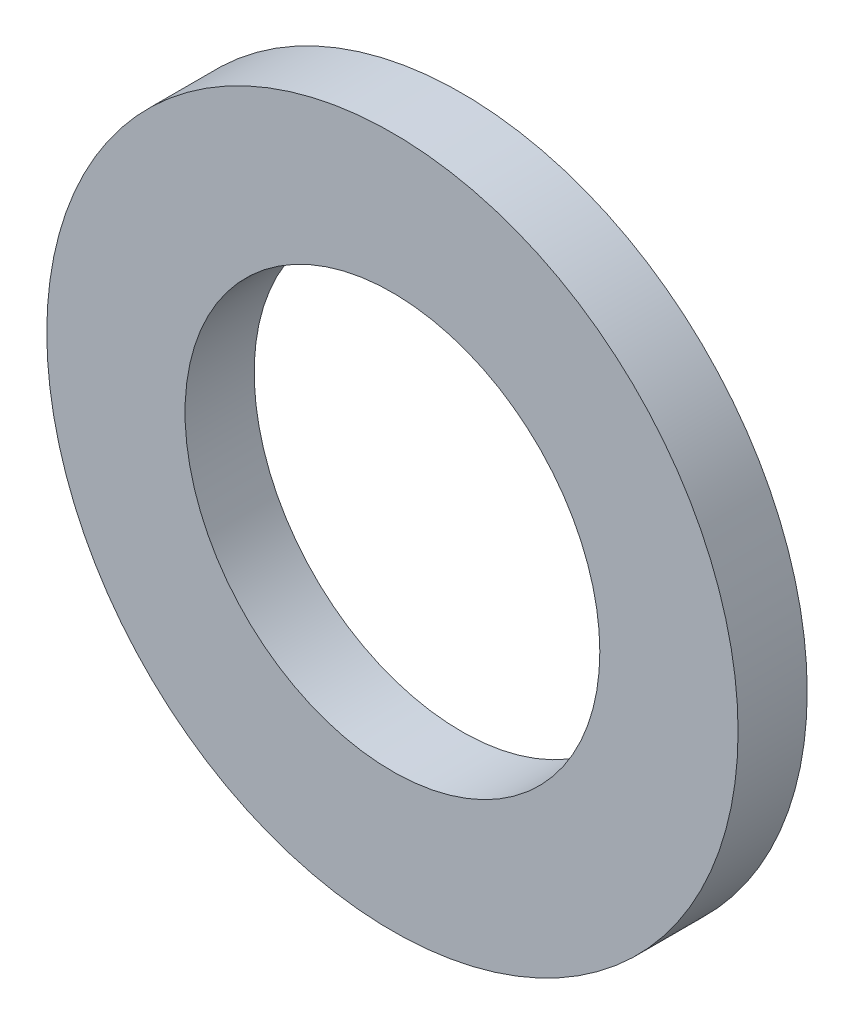
ISO-10303-21;
HEADER;
FILE_DESCRIPTION(('STEP AP214'),'2;1');
FILE_NAME('part.step','',(''),(''),'','','');
FILE_SCHEMA(('AUTOMOTIVE_DESIGN { 1 0 10303 214 1 1 1 1 }'));
ENDSEC;
DATA;
#1=APPLICATION_CONTEXT('core data for automotive mechanical design processes');
#2=APPLICATION_PROTOCOL_DEFINITION('international standard','automotive_design',2000,#1);
#3=PRODUCT_CONTEXT('',#1,'mechanical');
#4=PRODUCT('Part','Part','',(#3));
#5=PRODUCT_RELATED_PRODUCT_CATEGORY('part','',(#4));
#6=PRODUCT_DEFINITION_FORMATION('','',#4);
#7=PRODUCT_DEFINITION_CONTEXT('part definition',#1,'design');
#8=PRODUCT_DEFINITION('design','',#6,#7);
#9=PRODUCT_DEFINITION_SHAPE('','',#8);
#10=(LENGTH_UNIT() NAMED_UNIT(*) SI_UNIT(.MILLI.,.METRE.));
#11=(NAMED_UNIT(*) PLANE_ANGLE_UNIT() SI_UNIT($,.RADIAN.));
#12=(NAMED_UNIT(*) SI_UNIT($,.STERADIAN.) SOLID_ANGLE_UNIT());
#13=UNCERTAINTY_MEASURE_WITH_UNIT(LENGTH_MEASURE(1.E-05),#10,'distance_accuracy_value','');
#14=(GEOMETRIC_REPRESENTATION_CONTEXT(3) GLOBAL_UNCERTAINTY_ASSIGNED_CONTEXT((#13)) GLOBAL_UNIT_ASSIGNED_CONTEXT((#10,
#11,#12)) REPRESENTATION_CONTEXT('',''));
#15=CARTESIAN_POINT('',(0.,0.,0.));
#16=DIRECTION('',(0.,0.,1.));
#17=DIRECTION('',(1.,0.,0.));
#18=AXIS2_PLACEMENT_3D('',#15,#16,#17);
#19=CARTESIAN_POINT('',(0.,0.,2.));
#20=DIRECTION('',(0.,0.,1.));
#21=DIRECTION('',(1.,0.,0.));
#22=AXIS2_PLACEMENT_3D('',#19,#20,#21);
#23=PLANE('',#22);
#24=CARTESIAN_POINT('',(0.,0.,2.));
#25=DIRECTION('',(0.,0.,1.));
#26=DIRECTION('',(1.,0.,0.));
#27=AXIS2_PLACEMENT_3D('',#24,#25,#26);
#28=CIRCLE('',#27,10.);
#29=CARTESIAN_POINT('',(10.,0.,2.00000000000001));
#30=VERTEX_POINT('',#29);
#31=EDGE_CURVE('E10',#30,#30,#28,.T.);
#32=ORIENTED_EDGE('',*,*,#31,.T.);
#33=EDGE_LOOP('',(#32));
#34=FACE_BOUND('',#33,.T.);
#35=CARTESIAN_POINT('',(0.,0.,2.));
#36=DIRECTION('',(0.,0.,1.));
#37=DIRECTION('',(1.,0.,0.));
#38=AXIS2_PLACEMENT_3D('',#35,#36,#37);
#39=CIRCLE('',#38,6.);
#40=CARTESIAN_POINT('',(6.00000000000002,0.,2.));
#41=VERTEX_POINT('',#40);
#42=EDGE_CURVE('E40',#41,#41,#39,.T.);
#43=ORIENTED_EDGE('',*,*,#42,.F.);
#44=EDGE_LOOP('',(#43));
#45=FACE_BOUND('',#44,.T.);
#46=ADVANCED_FACE('F29',(#34,#45),#23,.T.);
#47=CARTESIAN_POINT('',(0.,0.,0.));
#48=DIRECTION('',(0.,0.,1.));
#49=DIRECTION('',(1.,0.,0.));
#50=AXIS2_PLACEMENT_3D('',#47,#48,#49);
#51=PLANE('',#50);
#52=CARTESIAN_POINT('',(0.,0.,0.));
#53=DIRECTION('',(0.,0.,1.));
#54=DIRECTION('',(1.,0.,0.));
#55=AXIS2_PLACEMENT_3D('',#52,#53,#54);
#56=CIRCLE('',#55,10.);
#57=CARTESIAN_POINT('',(10.,0.,0.));
#58=VERTEX_POINT('',#57);
#59=EDGE_CURVE('E36',#58,#58,#56,.T.);
#60=ORIENTED_EDGE('',*,*,#59,.F.);
#61=EDGE_LOOP('',(#60));
#62=FACE_BOUND('',#61,.T.);
#63=CARTESIAN_POINT('',(0.,0.,0.));
#64=DIRECTION('',(0.,0.,1.));
#65=DIRECTION('',(1.,0.,0.));
#66=AXIS2_PLACEMENT_3D('',#63,#64,#65);
#67=CIRCLE('',#66,6.);
#68=CARTESIAN_POINT('',(6.00000000000002,0.,0.));
#69=VERTEX_POINT('',#68);
#70=EDGE_CURVE('E44',#69,#69,#67,.T.);
#71=ORIENTED_EDGE('',*,*,#70,.T.);
#72=EDGE_LOOP('',(#71));
#73=FACE_BOUND('',#72,.T.);
#74=ADVANCED_FACE('F50',(#62,#73),#51,.F.);
#75=CARTESIAN_POINT('',(0.,0.,2.));
#76=DIRECTION('',(0.,0.,-1.));
#77=DIRECTION('',(-1.,0.,0.));
#78=AXIS2_PLACEMENT_3D('',#75,#76,#77);
#79=CYLINDRICAL_SURFACE('',#78,10.);
#80=ORIENTED_EDGE('',*,*,#31,.F.);
#81=EDGE_LOOP('',(#80));
#82=FACE_BOUND('',#81,.T.);
#83=ORIENTED_EDGE('',*,*,#59,.T.);
#84=EDGE_LOOP('',(#83));
#85=FACE_BOUND('',#84,.T.);
#86=ADVANCED_FACE('F31',(#82,#85),#79,.T.);
#87=CARTESIAN_POINT('',(0.,0.,2.));
#88=DIRECTION('',(0.,0.,-1.));
#89=DIRECTION('',(-1.,0.,0.));
#90=AXIS2_PLACEMENT_3D('',#87,#88,#89);
#91=CYLINDRICAL_SURFACE('',#90,6.);
#92=ORIENTED_EDGE('',*,*,#42,.T.);
#93=EDGE_LOOP('',(#92));
#94=FACE_BOUND('',#93,.T.);
#95=ORIENTED_EDGE('',*,*,#70,.F.);
#96=EDGE_LOOP('',(#95));
#97=FACE_BOUND('',#96,.T.);
#98=ADVANCED_FACE('F52',(#94,#97),#91,.F.);
#99=CLOSED_SHELL('',(#46,#74,#86,#98));
#100=MANIFOLD_SOLID_BREP('B2',#99);
#101=ADVANCED_BREP_SHAPE_REPRESENTATION('',(#18,#100),#14);
#102=SHAPE_DEFINITION_REPRESENTATION(#9,#101);
ENDSEC;
END-ISO-10303-21;
